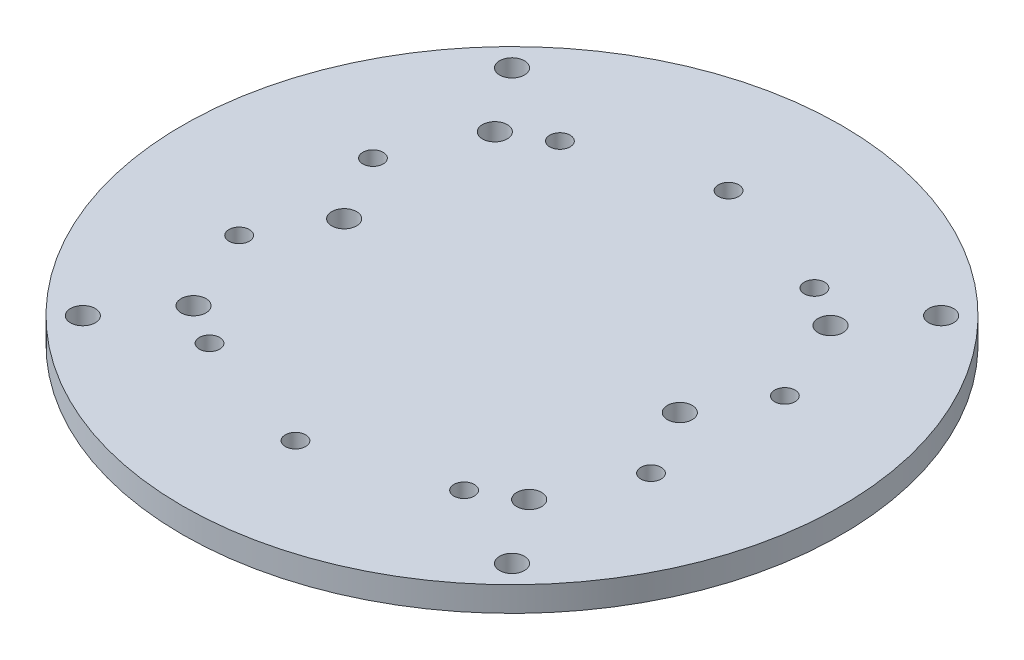
ISO-10303-21;
HEADER;
FILE_DESCRIPTION(('STEP AP214'),'2;1');
FILE_NAME('part.step','',(''),(''),'','','');
FILE_SCHEMA(('AUTOMOTIVE_DESIGN { 1 0 10303 214 1 1 1 1 }'));
ENDSEC;
DATA;
#1=APPLICATION_CONTEXT('core data for automotive mechanical design processes');
#2=APPLICATION_PROTOCOL_DEFINITION('international standard','automotive_design',2000,#1);
#3=PRODUCT_CONTEXT('',#1,'mechanical');
#4=PRODUCT('Part','Part','',(#3));
#5=PRODUCT_RELATED_PRODUCT_CATEGORY('part','',(#4));
#6=PRODUCT_DEFINITION_FORMATION('','',#4);
#7=PRODUCT_DEFINITION_CONTEXT('part definition',#1,'design');
#8=PRODUCT_DEFINITION('design','',#6,#7);
#9=PRODUCT_DEFINITION_SHAPE('','',#8);
#10=(LENGTH_UNIT() NAMED_UNIT(*) SI_UNIT(.MILLI.,.METRE.));
#11=(NAMED_UNIT(*) PLANE_ANGLE_UNIT() SI_UNIT($,.RADIAN.));
#12=(NAMED_UNIT(*) SI_UNIT($,.STERADIAN.) SOLID_ANGLE_UNIT());
#13=UNCERTAINTY_MEASURE_WITH_UNIT(LENGTH_MEASURE(1.E-05),#10,'distance_accuracy_value','');
#14=(GEOMETRIC_REPRESENTATION_CONTEXT(3) GLOBAL_UNCERTAINTY_ASSIGNED_CONTEXT((#13)) GLOBAL_UNIT_ASSIGNED_CONTEXT((#10,
#11,#12)) REPRESENTATION_CONTEXT('',''));
#15=CARTESIAN_POINT('',(0.,0.,0.));
#16=DIRECTION('',(0.,0.,1.));
#17=DIRECTION('',(1.,0.,0.));
#18=AXIS2_PLACEMENT_3D('',#15,#16,#17);
#19=CARTESIAN_POINT('',(0.,-73.15,0.));
#20=DIRECTION('',(0.,-1.,0.));
#21=DIRECTION('',(0.,0.,-1.));
#22=AXIS2_PLACEMENT_3D('',#19,#20,#21);
#23=PLANE('',#22);
#24=CARTESIAN_POINT('',(0.,-73.15,-55.3050224126499));
#25=DIRECTION('',(0.,-1.,0.));
#26=DIRECTION('',(0.,0.,-1.));
#27=AXIS2_PLACEMENT_3D('',#24,#25,#26);
#28=CIRCLE('',#27,2.6035);
#29=CARTESIAN_POINT('',(0.,-73.15,-57.9085224126499));
#30=VERTEX_POINT('',#29);
#31=EDGE_CURVE('E148',#30,#30,#28,.T.);
#32=ORIENTED_EDGE('',*,*,#31,.F.);
#33=EDGE_LOOP('',(#32));
#34=FACE_BOUND('',#33,.T.);
#35=CARTESIAN_POINT('',(52.5982019494002,-73.15,-17.0901917997961));
#36=DIRECTION('',(0.,-1.,0.));
#37=DIRECTION('',(0.,0.,-1.));
#38=AXIS2_PLACEMENT_3D('',#35,#36,#37);
#39=CIRCLE('',#38,2.6035);
#40=CARTESIAN_POINT('',(52.5982019494002,-73.15,-19.6936917997961));
#41=VERTEX_POINT('',#40);
#42=EDGE_CURVE('E136',#41,#41,#39,.T.);
#43=ORIENTED_EDGE('',*,*,#42,.F.);
#44=EDGE_LOOP('',(#43));
#45=FACE_BOUND('',#44,.T.);
#46=CARTESIAN_POINT('',(32.5074765518603,-73.15,44.7427030061211));
#47=DIRECTION('',(0.,-1.,0.));
#48=DIRECTION('',(0.,0.,-1.));
#49=AXIS2_PLACEMENT_3D('',#46,#47,#48);
#50=CIRCLE('',#49,2.6035);
#51=CARTESIAN_POINT('',(32.5074765518603,-73.15,42.1392030061211));
#52=VERTEX_POINT('',#51);
#53=EDGE_CURVE('E124',#52,#52,#50,.T.);
#54=ORIENTED_EDGE('',*,*,#53,.F.);
#55=EDGE_LOOP('',(#54));
#56=FACE_BOUND('',#55,.T.);
#57=CARTESIAN_POINT('',(-32.5074765518603,-73.15,44.7427030061211));
#58=DIRECTION('',(0.,-1.,0.));
#59=DIRECTION('',(0.,0.,-1.));
#60=AXIS2_PLACEMENT_3D('',#57,#58,#59);
#61=CIRCLE('',#60,2.6035);
#62=CARTESIAN_POINT('',(-32.5074765518603,-73.15,42.1392030061211));
#63=VERTEX_POINT('',#62);
#64=EDGE_CURVE('E112',#63,#63,#61,.T.);
#65=ORIENTED_EDGE('',*,*,#64,.F.);
#66=EDGE_LOOP('',(#65));
#67=FACE_BOUND('',#66,.T.);
#68=CARTESIAN_POINT('',(-52.5982019494002,-73.15,-17.0901917997962));
#69=DIRECTION('',(0.,-1.,0.));
#70=DIRECTION('',(0.,0.,-1.));
#71=AXIS2_PLACEMENT_3D('',#68,#69,#70);
#72=CIRCLE('',#71,2.6035);
#73=CARTESIAN_POINT('',(-52.5982019494002,-73.15,-19.6936917997962));
#74=VERTEX_POINT('',#73);
#75=EDGE_CURVE('E100',#74,#74,#72,.T.);
#76=ORIENTED_EDGE('',*,*,#75,.F.);
#77=EDGE_LOOP('',(#76));
#78=FACE_BOUND('',#77,.T.);
#79=CARTESIAN_POINT('',(42.8625,-73.15,0.));
#80=DIRECTION('',(0.,-1.,0.));
#81=DIRECTION('',(0.,0.,-1.));
#82=AXIS2_PLACEMENT_3D('',#79,#80,#81);
#83=CIRCLE('',#82,3.175);
#84=CARTESIAN_POINT('',(42.8625,-73.15,-3.175));
#85=VERTEX_POINT('',#84);
#86=EDGE_CURVE('E88',#85,#85,#83,.T.);
#87=ORIENTED_EDGE('',*,*,#86,.F.);
#88=EDGE_LOOP('',(#87));
#89=FACE_BOUND('',#88,.T.);
#90=CARTESIAN_POINT('',(-42.8625,-73.15,38.4762381014244));
#91=DIRECTION('',(0.,-1.,0.));
#92=DIRECTION('',(0.,0.,-1.));
#93=AXIS2_PLACEMENT_3D('',#90,#91,#92);
#94=CIRCLE('',#93,3.175);
#95=CARTESIAN_POINT('',(-42.8625,-73.15,35.3012381014244));
#96=VERTEX_POINT('',#95);
#97=EDGE_CURVE('E76',#96,#96,#94,.T.);
#98=ORIENTED_EDGE('',*,*,#97,.F.);
#99=EDGE_LOOP('',(#98));
#100=FACE_BOUND('',#99,.T.);
#101=CARTESIAN_POINT('',(-42.8625,-73.15,-38.4762381014244));
#102=DIRECTION('',(0.,-1.,0.));
#103=DIRECTION('',(0.,0.,-1.));
#104=AXIS2_PLACEMENT_3D('',#101,#102,#103);
#105=CIRCLE('',#104,3.175);
#106=CARTESIAN_POINT('',(-42.8625,-73.15,-41.6512381014244));
#107=VERTEX_POINT('',#106);
#108=EDGE_CURVE('E64',#107,#107,#105,.T.);
#109=ORIENTED_EDGE('',*,*,#108,.F.);
#110=EDGE_LOOP('',(#109));
#111=FACE_BOUND('',#110,.T.);
#112=CARTESIAN_POINT('',(-54.8007755419577,-73.15,-54.8007755419572));
#113=DIRECTION('',(0.,-1.,0.));
#114=DIRECTION('',(0.,0.,-1.));
#115=AXIS2_PLACEMENT_3D('',#112,#113,#114);
#116=CIRCLE('',#115,3.175);
#117=CARTESIAN_POINT('',(-54.8007755419577,-73.15,-57.9757755419572));
#118=VERTEX_POINT('',#117);
#119=EDGE_CURVE('E52',#118,#118,#116,.T.);
#120=ORIENTED_EDGE('',*,*,#119,.F.);
#121=EDGE_LOOP('',(#120));
#122=FACE_BOUND('',#121,.T.);
#123=CARTESIAN_POINT('',(54.8007755419577,-73.15,54.8007755419572));
#124=DIRECTION('',(0.,-1.,0.));
#125=DIRECTION('',(0.,0.,-1.));
#126=AXIS2_PLACEMENT_3D('',#123,#124,#125);
#127=CIRCLE('',#126,3.175);
#128=CARTESIAN_POINT('',(54.8007755419577,-73.15,51.6257755419572));
#129=VERTEX_POINT('',#128);
#130=EDGE_CURVE('E41',#129,#129,#127,.T.);
#131=ORIENTED_EDGE('',*,*,#130,.F.);
#132=EDGE_LOOP('',(#131));
#133=FACE_BOUND('',#132,.T.);
#134=CARTESIAN_POINT('',(0.,-73.15,0.));
#135=DIRECTION('',(0.,-1.,0.));
#136=DIRECTION('',(0.,0.,-1.));
#137=AXIS2_PLACEMENT_3D('',#134,#135,#136);
#138=CIRCLE('',#137,84.1675);
#139=CARTESIAN_POINT('',(0.,-73.15,-84.1675));
#140=VERTEX_POINT('',#139);
#141=EDGE_CURVE('E10',#140,#140,#138,.T.);
#142=ORIENTED_EDGE('',*,*,#141,.T.);
#143=EDGE_LOOP('',(#142));
#144=FACE_BOUND('',#143,.T.);
#145=CARTESIAN_POINT('',(54.8007755419572,-73.15,-54.8007755419577));
#146=DIRECTION('',(0.,-1.,0.));
#147=DIRECTION('',(0.,0.,-1.));
#148=AXIS2_PLACEMENT_3D('',#145,#146,#147);
#149=CIRCLE('',#148,3.175);
#150=CARTESIAN_POINT('',(54.8007755419572,-73.15,-57.9757755419577));
#151=VERTEX_POINT('',#150);
#152=EDGE_CURVE('E46',#151,#151,#149,.T.);
#153=ORIENTED_EDGE('',*,*,#152,.F.);
#154=EDGE_LOOP('',(#153));
#155=FACE_BOUND('',#154,.T.);
#156=CARTESIAN_POINT('',(-54.8007755419572,-73.15,54.8007755419577));
#157=DIRECTION('',(0.,-1.,0.));
#158=DIRECTION('',(0.,0.,-1.));
#159=AXIS2_PLACEMENT_3D('',#156,#157,#158);
#160=CIRCLE('',#159,3.17500000000001);
#161=CARTESIAN_POINT('',(-54.8007755419572,-73.15,51.6257755419577));
#162=VERTEX_POINT('',#161);
#163=EDGE_CURVE('E58',#162,#162,#160,.T.);
#164=ORIENTED_EDGE('',*,*,#163,.F.);
#165=EDGE_LOOP('',(#164));
#166=FACE_BOUND('',#165,.T.);
#167=CARTESIAN_POINT('',(-42.8625,-73.15,0.));
#168=DIRECTION('',(0.,-1.,0.));
#169=DIRECTION('',(0.,0.,-1.));
#170=AXIS2_PLACEMENT_3D('',#167,#168,#169);
#171=CIRCLE('',#170,3.175);
#172=CARTESIAN_POINT('',(-42.8625,-73.15,-3.175));
#173=VERTEX_POINT('',#172);
#174=EDGE_CURVE('E70',#173,#173,#171,.T.);
#175=ORIENTED_EDGE('',*,*,#174,.F.);
#176=EDGE_LOOP('',(#175));
#177=FACE_BOUND('',#176,.T.);
#178=CARTESIAN_POINT('',(42.8625,-73.15,38.4762381014244));
#179=DIRECTION('',(0.,-1.,0.));
#180=DIRECTION('',(0.,0.,-1.));
#181=AXIS2_PLACEMENT_3D('',#178,#179,#180);
#182=CIRCLE('',#181,3.175);
#183=CARTESIAN_POINT('',(42.8625,-73.15,35.3012381014244));
#184=VERTEX_POINT('',#183);
#185=EDGE_CURVE('E82',#184,#184,#182,.T.);
#186=ORIENTED_EDGE('',*,*,#185,.F.);
#187=EDGE_LOOP('',(#186));
#188=FACE_BOUND('',#187,.T.);
#189=CARTESIAN_POINT('',(42.8625,-73.15,-38.4762381014244));
#190=DIRECTION('',(0.,-1.,0.));
#191=DIRECTION('',(0.,0.,-1.));
#192=AXIS2_PLACEMENT_3D('',#189,#190,#191);
#193=CIRCLE('',#192,3.175);
#194=CARTESIAN_POINT('',(42.8625,-73.15,-41.6512381014244));
#195=VERTEX_POINT('',#194);
#196=EDGE_CURVE('E94',#195,#195,#193,.T.);
#197=ORIENTED_EDGE('',*,*,#196,.F.);
#198=EDGE_LOOP('',(#197));
#199=FACE_BOUND('',#198,.T.);
#200=CARTESIAN_POINT('',(-52.5982019494002,-73.15,17.0901917997962));
#201=DIRECTION('',(0.,-1.,0.));
#202=DIRECTION('',(0.,0.,-1.));
#203=AXIS2_PLACEMENT_3D('',#200,#201,#202);
#204=CIRCLE('',#203,2.6035);
#205=CARTESIAN_POINT('',(-52.5982019494002,-73.15,14.4866917997961));
#206=VERTEX_POINT('',#205);
#207=EDGE_CURVE('E106',#206,#206,#204,.T.);
#208=ORIENTED_EDGE('',*,*,#207,.F.);
#209=EDGE_LOOP('',(#208));
#210=FACE_BOUND('',#209,.T.);
#211=CARTESIAN_POINT('',(0.,-73.15,55.3050224126499));
#212=DIRECTION('',(0.,-1.,0.));
#213=DIRECTION('',(0.,0.,-1.));
#214=AXIS2_PLACEMENT_3D('',#211,#212,#213);
#215=CIRCLE('',#214,2.6035);
#216=CARTESIAN_POINT('',(0.,-73.15,52.7015224126499));
#217=VERTEX_POINT('',#216);
#218=EDGE_CURVE('E118',#217,#217,#215,.T.);
#219=ORIENTED_EDGE('',*,*,#218,.F.);
#220=EDGE_LOOP('',(#219));
#221=FACE_BOUND('',#220,.T.);
#222=CARTESIAN_POINT('',(52.5982019494002,-73.15,17.0901917997962));
#223=DIRECTION('',(0.,-1.,0.));
#224=DIRECTION('',(0.,0.,-1.));
#225=AXIS2_PLACEMENT_3D('',#222,#223,#224);
#226=CIRCLE('',#225,2.6035);
#227=CARTESIAN_POINT('',(52.5982019494002,-73.15,14.4866917997962));
#228=VERTEX_POINT('',#227);
#229=EDGE_CURVE('E130',#228,#228,#226,.T.);
#230=ORIENTED_EDGE('',*,*,#229,.F.);
#231=EDGE_LOOP('',(#230));
#232=FACE_BOUND('',#231,.T.);
#233=CARTESIAN_POINT('',(32.5074765518603,-73.15,-44.7427030061211));
#234=DIRECTION('',(0.,-1.,0.));
#235=DIRECTION('',(0.,0.,-1.));
#236=AXIS2_PLACEMENT_3D('',#233,#234,#235);
#237=CIRCLE('',#236,2.60350000000001);
#238=CARTESIAN_POINT('',(32.5074765518603,-73.15,-47.3462030061211));
#239=VERTEX_POINT('',#238);
#240=EDGE_CURVE('E142',#239,#239,#237,.T.);
#241=ORIENTED_EDGE('',*,*,#240,.F.);
#242=EDGE_LOOP('',(#241));
#243=FACE_BOUND('',#242,.T.);
#244=CARTESIAN_POINT('',(-32.5074765518603,-73.15,-44.7427030061211));
#245=DIRECTION('',(0.,-1.,0.));
#246=DIRECTION('',(0.,0.,-1.));
#247=AXIS2_PLACEMENT_3D('',#244,#245,#246);
#248=CIRCLE('',#247,2.6035);
#249=CARTESIAN_POINT('',(-32.5074765518603,-73.15,-47.3462030061211));
#250=VERTEX_POINT('',#249);
#251=EDGE_CURVE('E154',#250,#250,#248,.T.);
#252=ORIENTED_EDGE('',*,*,#251,.F.);
#253=EDGE_LOOP('',(#252));
#254=FACE_BOUND('',#253,.T.);
#255=ADVANCED_FACE('F30',(#34,#45,#56,#67,#78,#89,#100,#111,#122,#133,#144,#155,#166,#177,#188,
#199,#210,#221,#232,#243,#254),#23,.T.);
#256=CARTESIAN_POINT('',(0.,-66.8,0.));
#257=DIRECTION('',(0.,-1.,0.));
#258=DIRECTION('',(0.,0.,-1.));
#259=AXIS2_PLACEMENT_3D('',#256,#257,#258);
#260=PLANE('',#259);
#261=CARTESIAN_POINT('',(0.,-66.8,0.));
#262=DIRECTION('',(0.,-1.,0.));
#263=DIRECTION('',(0.,0.,-1.));
#264=AXIS2_PLACEMENT_3D('',#261,#262,#263);
#265=CIRCLE('',#264,84.1675);
#266=CARTESIAN_POINT('',(0.,-66.8,-84.1675));
#267=VERTEX_POINT('',#266);
#268=EDGE_CURVE('E34',#267,#267,#265,.T.);
#269=ORIENTED_EDGE('',*,*,#268,.F.);
#270=EDGE_LOOP('',(#269));
#271=FACE_BOUND('',#270,.T.);
#272=CARTESIAN_POINT('',(54.8007755419577,-66.8,54.8007755419572));
#273=DIRECTION('',(0.,-1.,0.));
#274=DIRECTION('',(0.,0.,-1.));
#275=AXIS2_PLACEMENT_3D('',#272,#273,#274);
#276=CIRCLE('',#275,3.175);
#277=CARTESIAN_POINT('',(54.8007755419577,-66.8,51.6257755419572));
#278=VERTEX_POINT('',#277);
#279=EDGE_CURVE('E43',#278,#278,#276,.T.);
#280=ORIENTED_EDGE('',*,*,#279,.T.);
#281=EDGE_LOOP('',(#280));
#282=FACE_BOUND('',#281,.T.);
#283=CARTESIAN_POINT('',(54.8007755419572,-66.8,-54.8007755419577));
#284=DIRECTION('',(0.,-1.,0.));
#285=DIRECTION('',(0.,0.,-1.));
#286=AXIS2_PLACEMENT_3D('',#283,#284,#285);
#287=CIRCLE('',#286,3.175);
#288=CARTESIAN_POINT('',(54.8007755419572,-66.8,-57.9757755419577));
#289=VERTEX_POINT('',#288);
#290=EDGE_CURVE('E49',#289,#289,#287,.T.);
#291=ORIENTED_EDGE('',*,*,#290,.T.);
#292=EDGE_LOOP('',(#291));
#293=FACE_BOUND('',#292,.T.);
#294=CARTESIAN_POINT('',(-54.8007755419577,-66.8,-54.8007755419572));
#295=DIRECTION('',(0.,-1.,0.));
#296=DIRECTION('',(0.,0.,-1.));
#297=AXIS2_PLACEMENT_3D('',#294,#295,#296);
#298=CIRCLE('',#297,3.175);
#299=CARTESIAN_POINT('',(-54.8007755419577,-66.8,-57.9757755419572));
#300=VERTEX_POINT('',#299);
#301=EDGE_CURVE('E55',#300,#300,#298,.T.);
#302=ORIENTED_EDGE('',*,*,#301,.T.);
#303=EDGE_LOOP('',(#302));
#304=FACE_BOUND('',#303,.T.);
#305=CARTESIAN_POINT('',(-54.8007755419572,-66.8,54.8007755419577));
#306=DIRECTION('',(0.,-1.,0.));
#307=DIRECTION('',(0.,0.,-1.));
#308=AXIS2_PLACEMENT_3D('',#305,#306,#307);
#309=CIRCLE('',#308,3.17500000000001);
#310=CARTESIAN_POINT('',(-54.8007755419572,-66.8,51.6257755419577));
#311=VERTEX_POINT('',#310);
#312=EDGE_CURVE('E61',#311,#311,#309,.T.);
#313=ORIENTED_EDGE('',*,*,#312,.T.);
#314=EDGE_LOOP('',(#313));
#315=FACE_BOUND('',#314,.T.);
#316=CARTESIAN_POINT('',(-42.8625,-66.8,-38.4762381014244));
#317=DIRECTION('',(0.,-1.,0.));
#318=DIRECTION('',(0.,0.,-1.));
#319=AXIS2_PLACEMENT_3D('',#316,#317,#318);
#320=CIRCLE('',#319,3.175);
#321=CARTESIAN_POINT('',(-42.8625,-66.8,-41.6512381014244));
#322=VERTEX_POINT('',#321);
#323=EDGE_CURVE('E67',#322,#322,#320,.T.);
#324=ORIENTED_EDGE('',*,*,#323,.T.);
#325=EDGE_LOOP('',(#324));
#326=FACE_BOUND('',#325,.T.);
#327=CARTESIAN_POINT('',(-42.8625,-66.8,0.));
#328=DIRECTION('',(0.,-1.,0.));
#329=DIRECTION('',(0.,0.,-1.));
#330=AXIS2_PLACEMENT_3D('',#327,#328,#329);
#331=CIRCLE('',#330,3.175);
#332=CARTESIAN_POINT('',(-42.8625,-66.8,-3.175));
#333=VERTEX_POINT('',#332);
#334=EDGE_CURVE('E73',#333,#333,#331,.T.);
#335=ORIENTED_EDGE('',*,*,#334,.T.);
#336=EDGE_LOOP('',(#335));
#337=FACE_BOUND('',#336,.T.);
#338=CARTESIAN_POINT('',(-42.8625,-66.8,38.4762381014244));
#339=DIRECTION('',(0.,-1.,0.));
#340=DIRECTION('',(0.,0.,-1.));
#341=AXIS2_PLACEMENT_3D('',#338,#339,#340);
#342=CIRCLE('',#341,3.175);
#343=CARTESIAN_POINT('',(-42.8625,-66.8,35.3012381014244));
#344=VERTEX_POINT('',#343);
#345=EDGE_CURVE('E79',#344,#344,#342,.T.);
#346=ORIENTED_EDGE('',*,*,#345,.T.);
#347=EDGE_LOOP('',(#346));
#348=FACE_BOUND('',#347,.T.);
#349=CARTESIAN_POINT('',(42.8625,-66.8,38.4762381014244));
#350=DIRECTION('',(0.,-1.,0.));
#351=DIRECTION('',(0.,0.,-1.));
#352=AXIS2_PLACEMENT_3D('',#349,#350,#351);
#353=CIRCLE('',#352,3.175);
#354=CARTESIAN_POINT('',(42.8625,-66.8,35.3012381014244));
#355=VERTEX_POINT('',#354);
#356=EDGE_CURVE('E85',#355,#355,#353,.T.);
#357=ORIENTED_EDGE('',*,*,#356,.T.);
#358=EDGE_LOOP('',(#357));
#359=FACE_BOUND('',#358,.T.);
#360=CARTESIAN_POINT('',(42.8625,-66.8,0.));
#361=DIRECTION('',(0.,-1.,0.));
#362=DIRECTION('',(0.,0.,-1.));
#363=AXIS2_PLACEMENT_3D('',#360,#361,#362);
#364=CIRCLE('',#363,3.175);
#365=CARTESIAN_POINT('',(42.8625,-66.8,-3.175));
#366=VERTEX_POINT('',#365);
#367=EDGE_CURVE('E91',#366,#366,#364,.T.);
#368=ORIENTED_EDGE('',*,*,#367,.T.);
#369=EDGE_LOOP('',(#368));
#370=FACE_BOUND('',#369,.T.);
#371=CARTESIAN_POINT('',(42.8625,-66.8,-38.4762381014244));
#372=DIRECTION('',(0.,-1.,0.));
#373=DIRECTION('',(0.,0.,-1.));
#374=AXIS2_PLACEMENT_3D('',#371,#372,#373);
#375=CIRCLE('',#374,3.175);
#376=CARTESIAN_POINT('',(42.8625,-66.8,-41.6512381014244));
#377=VERTEX_POINT('',#376);
#378=EDGE_CURVE('E97',#377,#377,#375,.T.);
#379=ORIENTED_EDGE('',*,*,#378,.T.);
#380=EDGE_LOOP('',(#379));
#381=FACE_BOUND('',#380,.T.);
#382=CARTESIAN_POINT('',(-52.5982019494002,-66.8,-17.0901917997962));
#383=DIRECTION('',(0.,-1.,0.));
#384=DIRECTION('',(0.,0.,-1.));
#385=AXIS2_PLACEMENT_3D('',#382,#383,#384);
#386=CIRCLE('',#385,2.6035);
#387=CARTESIAN_POINT('',(-52.5982019494002,-66.8,-19.6936917997962));
#388=VERTEX_POINT('',#387);
#389=EDGE_CURVE('E103',#388,#388,#386,.T.);
#390=ORIENTED_EDGE('',*,*,#389,.T.);
#391=EDGE_LOOP('',(#390));
#392=FACE_BOUND('',#391,.T.);
#393=CARTESIAN_POINT('',(-52.5982019494002,-66.8,17.0901917997962));
#394=DIRECTION('',(0.,-1.,0.));
#395=DIRECTION('',(0.,0.,-1.));
#396=AXIS2_PLACEMENT_3D('',#393,#394,#395);
#397=CIRCLE('',#396,2.6035);
#398=CARTESIAN_POINT('',(-52.5982019494002,-66.8,14.4866917997961));
#399=VERTEX_POINT('',#398);
#400=EDGE_CURVE('E109',#399,#399,#397,.T.);
#401=ORIENTED_EDGE('',*,*,#400,.T.);
#402=EDGE_LOOP('',(#401));
#403=FACE_BOUND('',#402,.T.);
#404=CARTESIAN_POINT('',(-32.5074765518603,-66.8,44.7427030061211));
#405=DIRECTION('',(0.,-1.,0.));
#406=DIRECTION('',(0.,0.,-1.));
#407=AXIS2_PLACEMENT_3D('',#404,#405,#406);
#408=CIRCLE('',#407,2.6035);
#409=CARTESIAN_POINT('',(-32.5074765518603,-66.8,42.1392030061211));
#410=VERTEX_POINT('',#409);
#411=EDGE_CURVE('E115',#410,#410,#408,.T.);
#412=ORIENTED_EDGE('',*,*,#411,.T.);
#413=EDGE_LOOP('',(#412));
#414=FACE_BOUND('',#413,.T.);
#415=CARTESIAN_POINT('',(0.,-66.8,55.3050224126499));
#416=DIRECTION('',(0.,-1.,0.));
#417=DIRECTION('',(0.,0.,-1.));
#418=AXIS2_PLACEMENT_3D('',#415,#416,#417);
#419=CIRCLE('',#418,2.6035);
#420=CARTESIAN_POINT('',(0.,-66.8,52.7015224126499));
#421=VERTEX_POINT('',#420);
#422=EDGE_CURVE('E121',#421,#421,#419,.T.);
#423=ORIENTED_EDGE('',*,*,#422,.T.);
#424=EDGE_LOOP('',(#423));
#425=FACE_BOUND('',#424,.T.);
#426=CARTESIAN_POINT('',(32.5074765518603,-66.8,44.7427030061211));
#427=DIRECTION('',(0.,-1.,0.));
#428=DIRECTION('',(0.,0.,-1.));
#429=AXIS2_PLACEMENT_3D('',#426,#427,#428);
#430=CIRCLE('',#429,2.6035);
#431=CARTESIAN_POINT('',(32.5074765518603,-66.8,42.1392030061211));
#432=VERTEX_POINT('',#431);
#433=EDGE_CURVE('E127',#432,#432,#430,.T.);
#434=ORIENTED_EDGE('',*,*,#433,.T.);
#435=EDGE_LOOP('',(#434));
#436=FACE_BOUND('',#435,.T.);
#437=CARTESIAN_POINT('',(52.5982019494002,-66.8,17.0901917997962));
#438=DIRECTION('',(0.,-1.,0.));
#439=DIRECTION('',(0.,0.,-1.));
#440=AXIS2_PLACEMENT_3D('',#437,#438,#439);
#441=CIRCLE('',#440,2.6035);
#442=CARTESIAN_POINT('',(52.5982019494002,-66.8,14.4866917997962));
#443=VERTEX_POINT('',#442);
#444=EDGE_CURVE('E133',#443,#443,#441,.T.);
#445=ORIENTED_EDGE('',*,*,#444,.T.);
#446=EDGE_LOOP('',(#445));
#447=FACE_BOUND('',#446,.T.);
#448=CARTESIAN_POINT('',(52.5982019494002,-66.8,-17.0901917997961));
#449=DIRECTION('',(0.,-1.,0.));
#450=DIRECTION('',(0.,0.,-1.));
#451=AXIS2_PLACEMENT_3D('',#448,#449,#450);
#452=CIRCLE('',#451,2.6035);
#453=CARTESIAN_POINT('',(52.5982019494002,-66.8,-19.6936917997961));
#454=VERTEX_POINT('',#453);
#455=EDGE_CURVE('E139',#454,#454,#452,.T.);
#456=ORIENTED_EDGE('',*,*,#455,.T.);
#457=EDGE_LOOP('',(#456));
#458=FACE_BOUND('',#457,.T.);
#459=CARTESIAN_POINT('',(32.5074765518603,-66.8,-44.7427030061211));
#460=DIRECTION('',(0.,-1.,0.));
#461=DIRECTION('',(0.,0.,-1.));
#462=AXIS2_PLACEMENT_3D('',#459,#460,#461);
#463=CIRCLE('',#462,2.60350000000001);
#464=CARTESIAN_POINT('',(32.5074765518603,-66.8,-47.3462030061211));
#465=VERTEX_POINT('',#464);
#466=EDGE_CURVE('E145',#465,#465,#463,.T.);
#467=ORIENTED_EDGE('',*,*,#466,.T.);
#468=EDGE_LOOP('',(#467));
#469=FACE_BOUND('',#468,.T.);
#470=CARTESIAN_POINT('',(0.,-66.8,-55.3050224126499));
#471=DIRECTION('',(0.,-1.,0.));
#472=DIRECTION('',(0.,0.,-1.));
#473=AXIS2_PLACEMENT_3D('',#470,#471,#472);
#474=CIRCLE('',#473,2.6035);
#475=CARTESIAN_POINT('',(0.,-66.8,-57.9085224126499));
#476=VERTEX_POINT('',#475);
#477=EDGE_CURVE('E151',#476,#476,#474,.T.);
#478=ORIENTED_EDGE('',*,*,#477,.T.);
#479=EDGE_LOOP('',(#478));
#480=FACE_BOUND('',#479,.T.);
#481=CARTESIAN_POINT('',(-32.5074765518603,-66.8,-44.7427030061211));
#482=DIRECTION('',(0.,-1.,0.));
#483=DIRECTION('',(0.,0.,-1.));
#484=AXIS2_PLACEMENT_3D('',#481,#482,#483);
#485=CIRCLE('',#484,2.6035);
#486=CARTESIAN_POINT('',(-32.5074765518603,-66.8,-47.3462030061211));
#487=VERTEX_POINT('',#486);
#488=EDGE_CURVE('E157',#487,#487,#485,.T.);
#489=ORIENTED_EDGE('',*,*,#488,.T.);
#490=EDGE_LOOP('',(#489));
#491=FACE_BOUND('',#490,.T.);
#492=ADVANCED_FACE('F167',(#271,#282,#293,#304,#315,#326,#337,#348,#359,#370,#381,#392,#403,
#414,#425,#436,#447,#458,#469,#480,#491),#260,.F.);
#493=CARTESIAN_POINT('',(0.,-73.15,0.));
#494=DIRECTION('',(0.,1.,0.));
#495=DIRECTION('',(0.,0.,1.));
#496=AXIS2_PLACEMENT_3D('',#493,#494,#495);
#497=CYLINDRICAL_SURFACE('',#496,84.1675);
#498=ORIENTED_EDGE('',*,*,#141,.F.);
#499=EDGE_LOOP('',(#498));
#500=FACE_BOUND('',#499,.T.);
#501=ORIENTED_EDGE('',*,*,#268,.T.);
#502=EDGE_LOOP('',(#501));
#503=FACE_BOUND('',#502,.T.);
#504=ADVANCED_FACE('F32',(#500,#503),#497,.T.);
#505=CARTESIAN_POINT('',(54.8007755419577,-73.15,54.8007755419572));
#506=DIRECTION('',(0.,1.,0.));
#507=DIRECTION('',(0.,0.,1.));
#508=AXIS2_PLACEMENT_3D('',#505,#506,#507);
#509=CYLINDRICAL_SURFACE('',#508,3.175);
#510=ORIENTED_EDGE('',*,*,#130,.T.);
#511=EDGE_LOOP('',(#510));
#512=FACE_BOUND('',#511,.T.);
#513=ORIENTED_EDGE('',*,*,#279,.F.);
#514=EDGE_LOOP('',(#513));
#515=FACE_BOUND('',#514,.T.);
#516=ADVANCED_FACE('F177',(#512,#515),#509,.F.);
#517=CARTESIAN_POINT('',(54.8007755419572,-73.15,-54.8007755419577));
#518=DIRECTION('',(0.,1.,0.));
#519=DIRECTION('',(0.,0.,1.));
#520=AXIS2_PLACEMENT_3D('',#517,#518,#519);
#521=CYLINDRICAL_SURFACE('',#520,3.175);
#522=ORIENTED_EDGE('',*,*,#152,.T.);
#523=EDGE_LOOP('',(#522));
#524=FACE_BOUND('',#523,.T.);
#525=ORIENTED_EDGE('',*,*,#290,.F.);
#526=EDGE_LOOP('',(#525));
#527=FACE_BOUND('',#526,.T.);
#528=ADVANCED_FACE('F180',(#524,#527),#521,.F.);
#529=CARTESIAN_POINT('',(-54.8007755419577,-73.15,-54.8007755419572));
#530=DIRECTION('',(0.,1.,0.));
#531=DIRECTION('',(0.,0.,1.));
#532=AXIS2_PLACEMENT_3D('',#529,#530,#531);
#533=CYLINDRICAL_SURFACE('',#532,3.175);
#534=ORIENTED_EDGE('',*,*,#119,.T.);
#535=EDGE_LOOP('',(#534));
#536=FACE_BOUND('',#535,.T.);
#537=ORIENTED_EDGE('',*,*,#301,.F.);
#538=EDGE_LOOP('',(#537));
#539=FACE_BOUND('',#538,.T.);
#540=ADVANCED_FACE('F184',(#536,#539),#533,.F.);
#541=CARTESIAN_POINT('',(-54.8007755419572,-73.15,54.8007755419577));
#542=DIRECTION('',(0.,1.,0.));
#543=DIRECTION('',(0.,0.,1.));
#544=AXIS2_PLACEMENT_3D('',#541,#542,#543);
#545=CYLINDRICAL_SURFACE('',#544,3.17500000000001);
#546=ORIENTED_EDGE('',*,*,#163,.T.);
#547=EDGE_LOOP('',(#546));
#548=FACE_BOUND('',#547,.T.);
#549=ORIENTED_EDGE('',*,*,#312,.F.);
#550=EDGE_LOOP('',(#549));
#551=FACE_BOUND('',#550,.T.);
#552=ADVANCED_FACE('F188',(#548,#551),#545,.F.);
#553=CARTESIAN_POINT('',(-42.8625,-73.15,-38.4762381014244));
#554=DIRECTION('',(0.,1.,0.));
#555=DIRECTION('',(0.,0.,1.));
#556=AXIS2_PLACEMENT_3D('',#553,#554,#555);
#557=CYLINDRICAL_SURFACE('',#556,3.175);
#558=ORIENTED_EDGE('',*,*,#108,.T.);
#559=EDGE_LOOP('',(#558));
#560=FACE_BOUND('',#559,.T.);
#561=ORIENTED_EDGE('',*,*,#323,.F.);
#562=EDGE_LOOP('',(#561));
#563=FACE_BOUND('',#562,.T.);
#564=ADVANCED_FACE('F192',(#560,#563),#557,.F.);
#565=CARTESIAN_POINT('',(-42.8625,-73.15,0.));
#566=DIRECTION('',(0.,1.,0.));
#567=DIRECTION('',(0.,0.,1.));
#568=AXIS2_PLACEMENT_3D('',#565,#566,#567);
#569=CYLINDRICAL_SURFACE('',#568,3.175);
#570=ORIENTED_EDGE('',*,*,#174,.T.);
#571=EDGE_LOOP('',(#570));
#572=FACE_BOUND('',#571,.T.);
#573=ORIENTED_EDGE('',*,*,#334,.F.);
#574=EDGE_LOOP('',(#573));
#575=FACE_BOUND('',#574,.T.);
#576=ADVANCED_FACE('F196',(#572,#575),#569,.F.);
#577=CARTESIAN_POINT('',(-42.8625,-73.15,38.4762381014244));
#578=DIRECTION('',(0.,1.,0.));
#579=DIRECTION('',(0.,0.,1.));
#580=AXIS2_PLACEMENT_3D('',#577,#578,#579);
#581=CYLINDRICAL_SURFACE('',#580,3.175);
#582=ORIENTED_EDGE('',*,*,#97,.T.);
#583=EDGE_LOOP('',(#582));
#584=FACE_BOUND('',#583,.T.);
#585=ORIENTED_EDGE('',*,*,#345,.F.);
#586=EDGE_LOOP('',(#585));
#587=FACE_BOUND('',#586,.T.);
#588=ADVANCED_FACE('F200',(#584,#587),#581,.F.);
#589=CARTESIAN_POINT('',(42.8625,-73.15,38.4762381014244));
#590=DIRECTION('',(0.,1.,0.));
#591=DIRECTION('',(0.,0.,1.));
#592=AXIS2_PLACEMENT_3D('',#589,#590,#591);
#593=CYLINDRICAL_SURFACE('',#592,3.175);
#594=ORIENTED_EDGE('',*,*,#185,.T.);
#595=EDGE_LOOP('',(#594));
#596=FACE_BOUND('',#595,.T.);
#597=ORIENTED_EDGE('',*,*,#356,.F.);
#598=EDGE_LOOP('',(#597));
#599=FACE_BOUND('',#598,.T.);
#600=ADVANCED_FACE('F204',(#596,#599),#593,.F.);
#601=CARTESIAN_POINT('',(42.8625,-73.15,0.));
#602=DIRECTION('',(0.,1.,0.));
#603=DIRECTION('',(0.,0.,1.));
#604=AXIS2_PLACEMENT_3D('',#601,#602,#603);
#605=CYLINDRICAL_SURFACE('',#604,3.175);
#606=ORIENTED_EDGE('',*,*,#86,.T.);
#607=EDGE_LOOP('',(#606));
#608=FACE_BOUND('',#607,.T.);
#609=ORIENTED_EDGE('',*,*,#367,.F.);
#610=EDGE_LOOP('',(#609));
#611=FACE_BOUND('',#610,.T.);
#612=ADVANCED_FACE('F208',(#608,#611),#605,.F.);
#613=CARTESIAN_POINT('',(42.8625,-73.15,-38.4762381014244));
#614=DIRECTION('',(0.,1.,0.));
#615=DIRECTION('',(0.,0.,1.));
#616=AXIS2_PLACEMENT_3D('',#613,#614,#615);
#617=CYLINDRICAL_SURFACE('',#616,3.175);
#618=ORIENTED_EDGE('',*,*,#196,.T.);
#619=EDGE_LOOP('',(#618));
#620=FACE_BOUND('',#619,.T.);
#621=ORIENTED_EDGE('',*,*,#378,.F.);
#622=EDGE_LOOP('',(#621));
#623=FACE_BOUND('',#622,.T.);
#624=ADVANCED_FACE('F212',(#620,#623),#617,.F.);
#625=CARTESIAN_POINT('',(-52.5982019494002,-73.15,-17.0901917997962));
#626=DIRECTION('',(0.,1.,0.));
#627=DIRECTION('',(0.,0.,1.));
#628=AXIS2_PLACEMENT_3D('',#625,#626,#627);
#629=CYLINDRICAL_SURFACE('',#628,2.6035);
#630=ORIENTED_EDGE('',*,*,#75,.T.);
#631=EDGE_LOOP('',(#630));
#632=FACE_BOUND('',#631,.T.);
#633=ORIENTED_EDGE('',*,*,#389,.F.);
#634=EDGE_LOOP('',(#633));
#635=FACE_BOUND('',#634,.T.);
#636=ADVANCED_FACE('F216',(#632,#635),#629,.F.);
#637=CARTESIAN_POINT('',(-52.5982019494002,-73.15,17.0901917997962));
#638=DIRECTION('',(0.,1.,0.));
#639=DIRECTION('',(0.,0.,1.));
#640=AXIS2_PLACEMENT_3D('',#637,#638,#639);
#641=CYLINDRICAL_SURFACE('',#640,2.6035);
#642=ORIENTED_EDGE('',*,*,#207,.T.);
#643=EDGE_LOOP('',(#642));
#644=FACE_BOUND('',#643,.T.);
#645=ORIENTED_EDGE('',*,*,#400,.F.);
#646=EDGE_LOOP('',(#645));
#647=FACE_BOUND('',#646,.T.);
#648=ADVANCED_FACE('F220',(#644,#647),#641,.F.);
#649=CARTESIAN_POINT('',(-32.5074765518603,-73.15,44.7427030061211));
#650=DIRECTION('',(0.,1.,0.));
#651=DIRECTION('',(0.,0.,1.));
#652=AXIS2_PLACEMENT_3D('',#649,#650,#651);
#653=CYLINDRICAL_SURFACE('',#652,2.6035);
#654=ORIENTED_EDGE('',*,*,#64,.T.);
#655=EDGE_LOOP('',(#654));
#656=FACE_BOUND('',#655,.T.);
#657=ORIENTED_EDGE('',*,*,#411,.F.);
#658=EDGE_LOOP('',(#657));
#659=FACE_BOUND('',#658,.T.);
#660=ADVANCED_FACE('F224',(#656,#659),#653,.F.);
#661=CARTESIAN_POINT('',(0.,-73.15,55.3050224126499));
#662=DIRECTION('',(0.,1.,0.));
#663=DIRECTION('',(0.,0.,1.));
#664=AXIS2_PLACEMENT_3D('',#661,#662,#663);
#665=CYLINDRICAL_SURFACE('',#664,2.6035);
#666=ORIENTED_EDGE('',*,*,#218,.T.);
#667=EDGE_LOOP('',(#666));
#668=FACE_BOUND('',#667,.T.);
#669=ORIENTED_EDGE('',*,*,#422,.F.);
#670=EDGE_LOOP('',(#669));
#671=FACE_BOUND('',#670,.T.);
#672=ADVANCED_FACE('F228',(#668,#671),#665,.F.);
#673=CARTESIAN_POINT('',(32.5074765518603,-73.15,44.7427030061211));
#674=DIRECTION('',(0.,1.,0.));
#675=DIRECTION('',(0.,0.,1.));
#676=AXIS2_PLACEMENT_3D('',#673,#674,#675);
#677=CYLINDRICAL_SURFACE('',#676,2.6035);
#678=ORIENTED_EDGE('',*,*,#53,.T.);
#679=EDGE_LOOP('',(#678));
#680=FACE_BOUND('',#679,.T.);
#681=ORIENTED_EDGE('',*,*,#433,.F.);
#682=EDGE_LOOP('',(#681));
#683=FACE_BOUND('',#682,.T.);
#684=ADVANCED_FACE('F232',(#680,#683),#677,.F.);
#685=CARTESIAN_POINT('',(52.5982019494002,-73.15,17.0901917997962));
#686=DIRECTION('',(0.,1.,0.));
#687=DIRECTION('',(0.,0.,1.));
#688=AXIS2_PLACEMENT_3D('',#685,#686,#687);
#689=CYLINDRICAL_SURFACE('',#688,2.6035);
#690=ORIENTED_EDGE('',*,*,#229,.T.);
#691=EDGE_LOOP('',(#690));
#692=FACE_BOUND('',#691,.T.);
#693=ORIENTED_EDGE('',*,*,#444,.F.);
#694=EDGE_LOOP('',(#693));
#695=FACE_BOUND('',#694,.T.);
#696=ADVANCED_FACE('F236',(#692,#695),#689,.F.);
#697=CARTESIAN_POINT('',(52.5982019494002,-73.15,-17.0901917997961));
#698=DIRECTION('',(0.,1.,0.));
#699=DIRECTION('',(0.,0.,1.));
#700=AXIS2_PLACEMENT_3D('',#697,#698,#699);
#701=CYLINDRICAL_SURFACE('',#700,2.6035);
#702=ORIENTED_EDGE('',*,*,#42,.T.);
#703=EDGE_LOOP('',(#702));
#704=FACE_BOUND('',#703,.T.);
#705=ORIENTED_EDGE('',*,*,#455,.F.);
#706=EDGE_LOOP('',(#705));
#707=FACE_BOUND('',#706,.T.);
#708=ADVANCED_FACE('F240',(#704,#707),#701,.F.);
#709=CARTESIAN_POINT('',(32.5074765518603,-73.15,-44.7427030061211));
#710=DIRECTION('',(0.,1.,0.));
#711=DIRECTION('',(0.,0.,1.));
#712=AXIS2_PLACEMENT_3D('',#709,#710,#711);
#713=CYLINDRICAL_SURFACE('',#712,2.60350000000001);
#714=ORIENTED_EDGE('',*,*,#240,.T.);
#715=EDGE_LOOP('',(#714));
#716=FACE_BOUND('',#715,.T.);
#717=ORIENTED_EDGE('',*,*,#466,.F.);
#718=EDGE_LOOP('',(#717));
#719=FACE_BOUND('',#718,.T.);
#720=ADVANCED_FACE('F244',(#716,#719),#713,.F.);
#721=CARTESIAN_POINT('',(0.,-73.15,-55.3050224126499));
#722=DIRECTION('',(0.,1.,0.));
#723=DIRECTION('',(0.,0.,1.));
#724=AXIS2_PLACEMENT_3D('',#721,#722,#723);
#725=CYLINDRICAL_SURFACE('',#724,2.6035);
#726=ORIENTED_EDGE('',*,*,#31,.T.);
#727=EDGE_LOOP('',(#726));
#728=FACE_BOUND('',#727,.T.);
#729=ORIENTED_EDGE('',*,*,#477,.F.);
#730=EDGE_LOOP('',(#729));
#731=FACE_BOUND('',#730,.T.);
#732=ADVANCED_FACE('F248',(#728,#731),#725,.F.);
#733=CARTESIAN_POINT('',(-32.5074765518603,-73.15,-44.7427030061211));
#734=DIRECTION('',(0.,1.,0.));
#735=DIRECTION('',(0.,0.,1.));
#736=AXIS2_PLACEMENT_3D('',#733,#734,#735);
#737=CYLINDRICAL_SURFACE('',#736,2.6035);
#738=ORIENTED_EDGE('',*,*,#251,.T.);
#739=EDGE_LOOP('',(#738));
#740=FACE_BOUND('',#739,.T.);
#741=ORIENTED_EDGE('',*,*,#488,.F.);
#742=EDGE_LOOP('',(#741));
#743=FACE_BOUND('',#742,.T.);
#744=ADVANCED_FACE('F163',(#740,#743),#737,.F.);
#745=CLOSED_SHELL('',(#255,#492,#504,#516,#528,#540,#552,#564,#576,#588,#600,#612,#624,#636,
#648,#660,#672,#684,#696,#708,#720,#732,#744));
#746=MANIFOLD_SOLID_BREP('B2',#745);
#747=ADVANCED_BREP_SHAPE_REPRESENTATION('',(#18,#746),#14);
#748=SHAPE_DEFINITION_REPRESENTATION(#9,#747);
ENDSEC;
END-ISO-10303-21;
